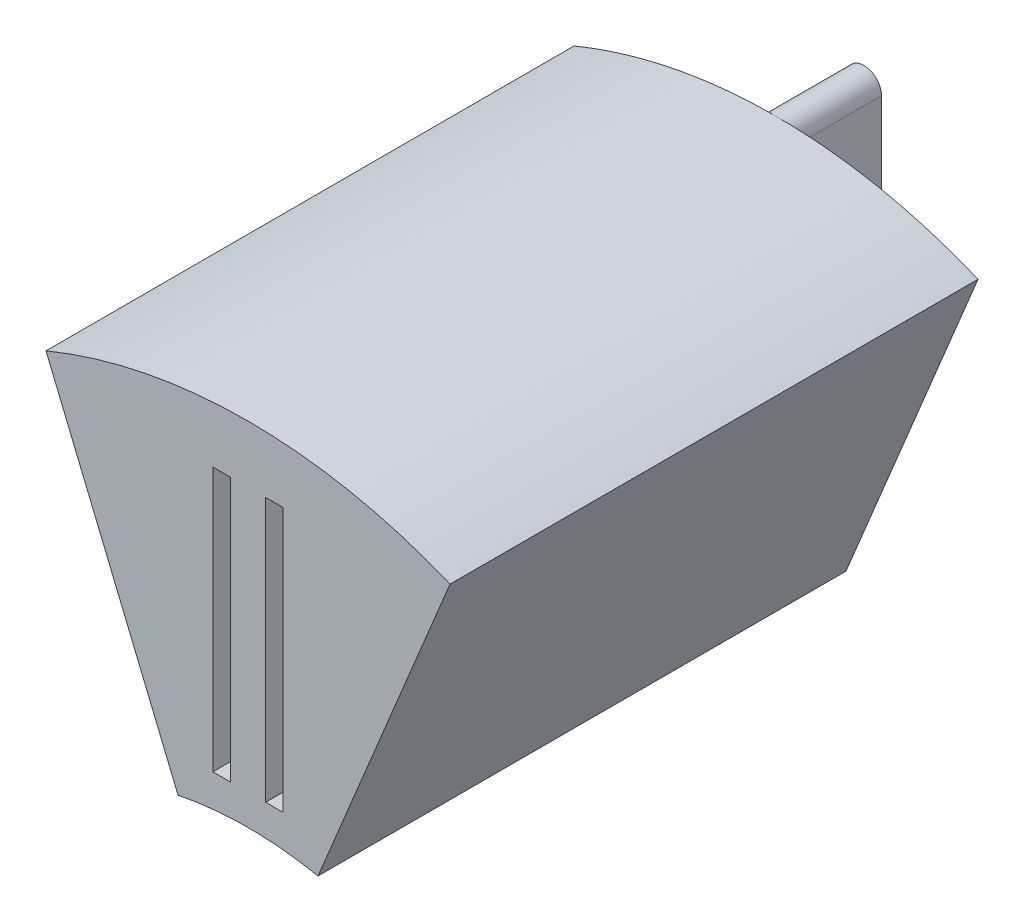
ISO-10303-21;
HEADER;
FILE_DESCRIPTION(('STEP AP214'),'2;1');
FILE_NAME('part.step','',(''),(''),'','','');
FILE_SCHEMA(('AUTOMOTIVE_DESIGN { 1 0 10303 214 1 1 1 1 }'));
ENDSEC;
DATA;
#1=APPLICATION_CONTEXT('core data for automotive mechanical design processes');
#2=APPLICATION_PROTOCOL_DEFINITION('international standard','automotive_design',2000,#1);
#3=PRODUCT_CONTEXT('',#1,'mechanical');
#4=PRODUCT('Part','Part','',(#3));
#5=PRODUCT_RELATED_PRODUCT_CATEGORY('part','',(#4));
#6=PRODUCT_DEFINITION_FORMATION('','',#4);
#7=PRODUCT_DEFINITION_CONTEXT('part definition',#1,'design');
#8=PRODUCT_DEFINITION('design','',#6,#7);
#9=PRODUCT_DEFINITION_SHAPE('','',#8);
#10=(LENGTH_UNIT() NAMED_UNIT(*) SI_UNIT(.MILLI.,.METRE.));
#11=(NAMED_UNIT(*) PLANE_ANGLE_UNIT() SI_UNIT($,.RADIAN.));
#12=(NAMED_UNIT(*) SI_UNIT($,.STERADIAN.) SOLID_ANGLE_UNIT());
#13=UNCERTAINTY_MEASURE_WITH_UNIT(LENGTH_MEASURE(1.E-05),#10,'distance_accuracy_value','');
#14=(GEOMETRIC_REPRESENTATION_CONTEXT(3) GLOBAL_UNCERTAINTY_ASSIGNED_CONTEXT((#13)) GLOBAL_UNIT_ASSIGNED_CONTEXT((#10,
#11,#12)) REPRESENTATION_CONTEXT('',''));
#15=CARTESIAN_POINT('',(0.,0.,0.));
#16=DIRECTION('',(0.,0.,1.));
#17=DIRECTION('',(1.,0.,0.));
#18=AXIS2_PLACEMENT_3D('',#15,#16,#17);
#19=CARTESIAN_POINT('',(0.,0.,0.));
#20=DIRECTION('',(0.,0.,1.));
#21=DIRECTION('',(1.,0.,0.));
#22=AXIS2_PLACEMENT_3D('',#19,#20,#21);
#23=PLANE('',#22);
#24=DIRECTION('',(0.,1.,0.));
#25=VECTOR('',#24,1.);
#26=CARTESIAN_POINT('',(-0.1,2.,0.));
#27=LINE('',#26,#25);
#28=CARTESIAN_POINT('',(-0.0999999999999996,2.,0.));
#29=VERTEX_POINT('',#28);
#30=CARTESIAN_POINT('',(-0.1,2.9,0.));
#31=VERTEX_POINT('',#30);
#32=EDGE_CURVE('E229',#29,#31,#27,.T.);
#33=ORIENTED_EDGE('',*,*,#32,.F.);
#34=DIRECTION('',(1.,0.,0.));
#35=VECTOR('',#34,1.);
#36=CARTESIAN_POINT('',(1.54782838582053,2.,0.));
#37=LINE('',#36,#35);
#38=CARTESIAN_POINT('',(0.1,2.,0.));
#39=VERTEX_POINT('',#38);
#40=EDGE_CURVE('E257',#29,#39,#37,.T.);
#41=ORIENTED_EDGE('',*,*,#40,.T.);
#42=DIRECTION('',(0.,-1.,0.));
#43=VECTOR('',#42,1.);
#44=CARTESIAN_POINT('',(0.1,2.,0.));
#45=LINE('',#44,#43);
#46=CARTESIAN_POINT('',(0.1,2.9,0.));
#47=VERTEX_POINT('',#46);
#48=EDGE_CURVE('E62',#47,#39,#45,.T.);
#49=ORIENTED_EDGE('',*,*,#48,.F.);
#50=CARTESIAN_POINT('',(0.,2.9,0.));
#51=DIRECTION('',(0.,0.,-1.));
#52=DIRECTION('',(-1.,0.,0.));
#53=AXIS2_PLACEMENT_3D('',#50,#51,#52);
#54=CIRCLE('',#53,0.1);
#55=CARTESIAN_POINT('',(0.,3.,0.));
#56=VERTEX_POINT('',#55);
#57=EDGE_CURVE('E214',#56,#47,#54,.T.);
#58=ORIENTED_EDGE('',*,*,#57,.F.);
#59=CARTESIAN_POINT('',(0.,0.,0.));
#60=DIRECTION('',(0.,0.,1.));
#61=DIRECTION('',(1.,0.,0.));
#62=AXIS2_PLACEMENT_3D('',#59,#60,#61);
#63=CIRCLE('',#62,3.);
#64=CARTESIAN_POINT('',(1.14805029709527,2.77163859753386,0.));
#65=VERTEX_POINT('',#64);
#66=EDGE_CURVE('E178',#65,#56,#63,.T.);
#67=ORIENTED_EDGE('',*,*,#66,.F.);
#68=DIRECTION('',(0.38268343236509,0.923879532511287,0.));
#69=VECTOR('',#68,1.);
#70=CARTESIAN_POINT('',(1.14805029709527,2.77163859753386,0.));
#71=LINE('',#70,#69);
#72=CARTESIAN_POINT('',(0.397672160236953,0.960065522622261,0.));
#73=VERTEX_POINT('',#72);
#74=EDGE_CURVE('E187',#73,#65,#71,.T.);
#75=ORIENTED_EDGE('',*,*,#74,.F.);
#76=CARTESIAN_POINT('',(0.,-1.,0.));
#77=DIRECTION('',(0.,0.,1.));
#78=DIRECTION('',(1.,0.,0.));
#79=AXIS2_PLACEMENT_3D('',#76,#77,#78);
#80=CIRCLE('',#79,2.);
#81=CARTESIAN_POINT('',(-0.397672160236953,0.960065522622261,0.));
#82=VERTEX_POINT('',#81);
#83=EDGE_CURVE('E54',#73,#82,#80,.T.);
#84=ORIENTED_EDGE('',*,*,#83,.T.);
#85=DIRECTION('',(0.38268343236509,-0.923879532511287,0.));
#86=VECTOR('',#85,1.);
#87=CARTESIAN_POINT('',(-1.14805029709527,2.77163859753386,0.));
#88=LINE('',#87,#86);
#89=CARTESIAN_POINT('',(-1.14805029709527,2.77163859753386,0.));
#90=VERTEX_POINT('',#89);
#91=EDGE_CURVE('E197',#90,#82,#88,.T.);
#92=ORIENTED_EDGE('',*,*,#91,.F.);
#93=EDGE_CURVE('E173',#56,#90,#63,.T.);
#94=ORIENTED_EDGE('',*,*,#93,.F.);
#95=EDGE_CURVE('E221',#31,#56,#54,.T.);
#96=ORIENTED_EDGE('',*,*,#95,.F.);
#97=EDGE_LOOP('',(#33,#41,#49,#58,#67,#75,#84,#92,#94,#96));
#98=FACE_BOUND('',#97,.T.);
#99=ADVANCED_FACE('F38',(#98),#23,.F.);
#100=CARTESIAN_POINT('',(0.2,1.17387953251129,1.));
#101=DIRECTION('',(0.,-0.8,0.6));
#102=DIRECTION('',(0.,-0.6,-0.8));
#103=AXIS2_PLACEMENT_3D('',#100,#101,#102);
#104=PLANE('',#103);
#105=DIRECTION('',(0.,-0.6,-0.8));
#106=VECTOR('',#105,1.);
#107=CARTESIAN_POINT('',(-0.1,1.17387953251129,1.));
#108=LINE('',#107,#106);
#109=CARTESIAN_POINT('',(-0.1,2.67387953251129,3.));
#110=VERTEX_POINT('',#109);
#111=CARTESIAN_POINT('',(-0.1,1.17387953251129,1.));
#112=VERTEX_POINT('',#111);
#113=EDGE_CURVE('E166',#110,#112,#108,.T.);
#114=ORIENTED_EDGE('',*,*,#113,.F.);
#115=DIRECTION('',(-1.,0.,0.));
#116=VECTOR('',#115,1.);
#117=CARTESIAN_POINT('',(0.2,2.67387953251129,3.));
#118=LINE('',#117,#116);
#119=CARTESIAN_POINT('',(-0.2,2.67387953251129,3.));
#120=VERTEX_POINT('',#119);
#121=EDGE_CURVE('E174',#110,#120,#118,.T.);
#122=ORIENTED_EDGE('',*,*,#121,.T.);
#123=DIRECTION('',(0.,0.6,0.8));
#124=VECTOR('',#123,1.);
#125=CARTESIAN_POINT('',(-0.2,1.17387953251129,1.));
#126=LINE('',#125,#124);
#127=CARTESIAN_POINT('',(-0.2,1.17387953251129,1.));
#128=VERTEX_POINT('',#127);
#129=EDGE_CURVE('E283',#128,#120,#126,.T.);
#130=ORIENTED_EDGE('',*,*,#129,.F.);
#131=DIRECTION('',(-1.,0.,0.));
#132=VECTOR('',#131,1.);
#133=CARTESIAN_POINT('',(0.2,1.17387953251129,1.));
#134=LINE('',#133,#132);
#135=EDGE_CURVE('E301',#112,#128,#134,.T.);
#136=ORIENTED_EDGE('',*,*,#135,.F.);
#137=EDGE_LOOP('',(#114,#122,#130,#136));
#138=FACE_BOUND('',#137,.T.);
#139=ADVANCED_FACE('F318',(#138),#104,.T.);
#140=CARTESIAN_POINT('',(0.2,1.17387953251129,3.));
#141=DIRECTION('',(0.,1.,0.));
#142=DIRECTION('',(0.,0.,1.));
#143=AXIS2_PLACEMENT_3D('',#140,#141,#142);
#144=PLANE('',#143);
#145=DIRECTION('',(0.,0.,1.));
#146=VECTOR('',#145,1.);
#147=CARTESIAN_POINT('',(-0.1,1.17387953251129,3.));
#148=LINE('',#147,#146);
#149=CARTESIAN_POINT('',(-0.1,1.17387953251129,3.));
#150=VERTEX_POINT('',#149);
#151=EDGE_CURVE('E211',#112,#150,#148,.T.);
#152=ORIENTED_EDGE('',*,*,#151,.F.);
#153=ORIENTED_EDGE('',*,*,#135,.T.);
#154=DIRECTION('',(0.,0.,-1.));
#155=VECTOR('',#154,1.);
#156=CARTESIAN_POINT('',(-0.2,1.17387953251129,3.));
#157=LINE('',#156,#155);
#158=CARTESIAN_POINT('',(-0.2,1.17387953251129,3.));
#159=VERTEX_POINT('',#158);
#160=EDGE_CURVE('E290',#159,#128,#157,.T.);
#161=ORIENTED_EDGE('',*,*,#160,.F.);
#162=DIRECTION('',(-1.,0.,0.));
#163=VECTOR('',#162,1.);
#164=CARTESIAN_POINT('',(0.2,1.17387953251129,3.));
#165=LINE('',#164,#163);
#166=EDGE_CURVE('E304',#150,#159,#165,.T.);
#167=ORIENTED_EDGE('',*,*,#166,.F.);
#168=EDGE_LOOP('',(#152,#153,#161,#167));
#169=FACE_BOUND('',#168,.T.);
#170=ADVANCED_FACE('F314',(#169),#144,.T.);
#171=CARTESIAN_POINT('',(0.,0.,3.));
#172=DIRECTION('',(0.,0.,1.));
#173=DIRECTION('',(1.,0.,0.));
#174=AXIS2_PLACEMENT_3D('',#171,#172,#173);
#175=PLANE('',#174);
#176=CARTESIAN_POINT('',(0.2,1.17387953251129,3.));
#177=VERTEX_POINT('',#176);
#178=CARTESIAN_POINT('',(0.1,1.17387953251129,3.));
#179=VERTEX_POINT('',#178);
#180=EDGE_CURVE('E152',#177,#179,#165,.T.);
#181=ORIENTED_EDGE('',*,*,#180,.T.);
#182=DIRECTION('',(0.,1.,0.));
#183=VECTOR('',#182,1.);
#184=CARTESIAN_POINT('',(0.1,2.67387953251129,3.));
#185=LINE('',#184,#183);
#186=CARTESIAN_POINT('',(0.1,2.67387953251129,3.));
#187=VERTEX_POINT('',#186);
#188=EDGE_CURVE('E145',#179,#187,#185,.T.);
#189=ORIENTED_EDGE('',*,*,#188,.T.);
#190=CARTESIAN_POINT('',(0.2,2.67387953251129,3.));
#191=VERTEX_POINT('',#190);
#192=EDGE_CURVE('E150',#191,#187,#118,.T.);
#193=ORIENTED_EDGE('',*,*,#192,.F.);
#194=DIRECTION('',(0.,-1.,0.));
#195=VECTOR('',#194,1.);
#196=CARTESIAN_POINT('',(0.2,2.67387953251129,3.));
#197=LINE('',#196,#195);
#198=EDGE_CURVE('E296',#191,#177,#197,.T.);
#199=ORIENTED_EDGE('',*,*,#198,.T.);
#200=EDGE_LOOP('',(#181,#189,#193,#199));
#201=FACE_BOUND('',#200,.T.);
#202=CARTESIAN_POINT('',(0.,0.,3.));
#203=DIRECTION('',(0.,0.,1.));
#204=DIRECTION('',(1.,0.,0.));
#205=AXIS2_PLACEMENT_3D('',#202,#203,#204);
#206=CIRCLE('',#205,3.);
#207=CARTESIAN_POINT('',(1.14805029709527,2.77163859753386,3.));
#208=VERTEX_POINT('',#207);
#209=CARTESIAN_POINT('',(-1.14805029709527,2.77163859753386,3.));
#210=VERTEX_POINT('',#209);
#211=EDGE_CURVE('E183',#208,#210,#206,.T.);
#212=ORIENTED_EDGE('',*,*,#211,.T.);
#213=DIRECTION('',(0.38268343236509,-0.923879532511287,0.));
#214=VECTOR('',#213,1.);
#215=CARTESIAN_POINT('',(-1.14805029709527,2.77163859753386,3.));
#216=LINE('',#215,#214);
#217=CARTESIAN_POINT('',(-0.397672160236953,0.960065522622261,3.));
#218=VERTEX_POINT('',#217);
#219=EDGE_CURVE('E186',#210,#218,#216,.T.);
#220=ORIENTED_EDGE('',*,*,#219,.T.);
#221=CARTESIAN_POINT('',(0.,-1.,3.));
#222=DIRECTION('',(0.,0.,1.));
#223=DIRECTION('',(1.,0.,0.));
#224=AXIS2_PLACEMENT_3D('',#221,#222,#223);
#225=CIRCLE('',#224,2.);
#226=CARTESIAN_POINT('',(0.397672160236953,0.960065522622261,3.));
#227=VERTEX_POINT('',#226);
#228=EDGE_CURVE('E254',#227,#218,#225,.T.);
#229=ORIENTED_EDGE('',*,*,#228,.F.);
#230=DIRECTION('',(0.38268343236509,0.923879532511287,0.));
#231=VECTOR('',#230,1.);
#232=CARTESIAN_POINT('',(1.14805029709527,2.77163859753386,3.));
#233=LINE('',#232,#231);
#234=EDGE_CURVE('E191',#227,#208,#233,.T.);
#235=ORIENTED_EDGE('',*,*,#234,.T.);
#236=EDGE_LOOP('',(#212,#220,#229,#235));
#237=FACE_BOUND('',#236,.T.);
#238=ORIENTED_EDGE('',*,*,#121,.F.);
#239=DIRECTION('',(0.,-1.,0.));
#240=VECTOR('',#239,1.);
#241=CARTESIAN_POINT('',(-0.1,2.67387953251129,3.));
#242=LINE('',#241,#240);
#243=EDGE_CURVE('E157',#110,#150,#242,.T.);
#244=ORIENTED_EDGE('',*,*,#243,.T.);
#245=ORIENTED_EDGE('',*,*,#166,.T.);
#246=DIRECTION('',(0.,-1.,0.));
#247=VECTOR('',#246,1.);
#248=CARTESIAN_POINT('',(-0.2,2.67387953251129,3.));
#249=LINE('',#248,#247);
#250=EDGE_CURVE('E287',#120,#159,#249,.T.);
#251=ORIENTED_EDGE('',*,*,#250,.F.);
#252=EDGE_LOOP('',(#238,#244,#245,#251));
#253=FACE_BOUND('',#252,.T.);
#254=ADVANCED_FACE('F147',(#201,#237,#253),#175,.T.);
#255=CARTESIAN_POINT('',(0.,0.,3.));
#256=DIRECTION('',(0.,0.,-1.));
#257=DIRECTION('',(-1.,0.,0.));
#258=AXIS2_PLACEMENT_3D('',#255,#256,#257);
#259=CYLINDRICAL_SURFACE('',#258,3.);
#260=ORIENTED_EDGE('',*,*,#66,.T.);
#261=ORIENTED_EDGE('',*,*,#93,.T.);
#262=DIRECTION('',(0.,0.,-1.));
#263=VECTOR('',#262,1.);
#264=CARTESIAN_POINT('',(-1.14805029709527,2.77163859753386,3.));
#265=LINE('',#264,#263);
#266=EDGE_CURVE('E205',#210,#90,#265,.T.);
#267=ORIENTED_EDGE('',*,*,#266,.F.);
#268=ORIENTED_EDGE('',*,*,#211,.F.);
#269=DIRECTION('',(0.,0.,-1.));
#270=VECTOR('',#269,1.);
#271=CARTESIAN_POINT('',(1.14805029709527,2.77163859753386,3.));
#272=LINE('',#271,#270);
#273=EDGE_CURVE('E193',#208,#65,#272,.T.);
#274=ORIENTED_EDGE('',*,*,#273,.T.);
#275=EDGE_LOOP('',(#260,#261,#267,#268,#274));
#276=FACE_BOUND('',#275,.T.);
#277=ADVANCED_FACE('F40',(#276),#259,.T.);
#278=CARTESIAN_POINT('',(-1.14805029709527,2.77163859753386,3.));
#279=DIRECTION('',(0.923879532511287,0.38268343236509,0.));
#280=DIRECTION('',(-0.38268343236509,0.923879532511287,0.));
#281=AXIS2_PLACEMENT_3D('',#278,#279,#280);
#282=PLANE('',#281);
#283=ORIENTED_EDGE('',*,*,#91,.T.);
#284=DIRECTION('',(0.,0.,1.));
#285=VECTOR('',#284,1.);
#286=CARTESIAN_POINT('',(-0.397672160236953,0.96006552262226,0.));
#287=LINE('',#286,#285);
#288=EDGE_CURVE('E235',#82,#218,#287,.T.);
#289=ORIENTED_EDGE('',*,*,#288,.T.);
#290=ORIENTED_EDGE('',*,*,#219,.F.);
#291=ORIENTED_EDGE('',*,*,#266,.T.);
#292=EDGE_LOOP('',(#283,#289,#290,#291));
#293=FACE_BOUND('',#292,.T.);
#294=ADVANCED_FACE('F345',(#293),#282,.F.);
#295=CARTESIAN_POINT('',(1.14805029709527,2.77163859753386,3.));
#296=DIRECTION('',(-0.923879532511287,0.38268343236509,0.));
#297=DIRECTION('',(-0.38268343236509,-0.923879532511287,0.));
#298=AXIS2_PLACEMENT_3D('',#295,#296,#297);
#299=PLANE('',#298);
#300=ORIENTED_EDGE('',*,*,#234,.F.);
#301=DIRECTION('',(0.,0.,1.));
#302=VECTOR('',#301,1.);
#303=CARTESIAN_POINT('',(0.397672160236953,0.96006552262226,0.));
#304=LINE('',#303,#302);
#305=EDGE_CURVE('E47',#227,#73,#304,.F.);
#306=ORIENTED_EDGE('',*,*,#305,.T.);
#307=ORIENTED_EDGE('',*,*,#74,.T.);
#308=ORIENTED_EDGE('',*,*,#273,.F.);
#309=EDGE_LOOP('',(#300,#306,#307,#308));
#310=FACE_BOUND('',#309,.T.);
#311=ADVANCED_FACE('F334',(#310),#299,.F.);
#312=CARTESIAN_POINT('',(0.1,2.,3.5));
#313=DIRECTION('',(-1.,0.,0.));
#314=DIRECTION('',(0.,0.,1.));
#315=AXIS2_PLACEMENT_3D('',#312,#313,#314);
#316=PLANE('',#315);
#317=DIRECTION('',(0.,0.6,0.8));
#318=VECTOR('',#317,1.);
#319=CARTESIAN_POINT('',(0.1,1.17387953251129,1.));
#320=LINE('',#319,#318);
#321=CARTESIAN_POINT('',(0.1,1.17387953251129,1.));
#322=VERTEX_POINT('',#321);
#323=EDGE_CURVE('E156',#322,#187,#320,.T.);
#324=ORIENTED_EDGE('',*,*,#323,.T.);
#325=ORIENTED_EDGE('',*,*,#188,.F.);
#326=DIRECTION('',(0.,0.,-1.));
#327=VECTOR('',#326,1.);
#328=CARTESIAN_POINT('',(0.1,1.17387953251129,3.));
#329=LINE('',#328,#327);
#330=EDGE_CURVE('E161',#179,#322,#329,.T.);
#331=ORIENTED_EDGE('',*,*,#330,.T.);
#332=EDGE_LOOP('',(#324,#325,#331));
#333=FACE_BOUND('',#332,.T.);
#334=ADVANCED_FACE('F160',(#333),#316,.F.);
#335=CARTESIAN_POINT('',(-0.1,2.,3.5));
#336=DIRECTION('',(1.,0.,0.));
#337=DIRECTION('',(0.,0.,-1.));
#338=AXIS2_PLACEMENT_3D('',#335,#336,#337);
#339=PLANE('',#338);
#340=ORIENTED_EDGE('',*,*,#243,.F.);
#341=ORIENTED_EDGE('',*,*,#113,.T.);
#342=ORIENTED_EDGE('',*,*,#151,.T.);
#343=EDGE_LOOP('',(#340,#341,#342));
#344=FACE_BOUND('',#343,.T.);
#345=ADVANCED_FACE('F325',(#344),#339,.F.);
#346=ORIENTED_EDGE('',*,*,#323,.F.);
#347=CARTESIAN_POINT('',(0.2,1.17387953251129,1.));
#348=VERTEX_POINT('',#347);
#349=EDGE_CURVE('E302',#348,#322,#134,.T.);
#350=ORIENTED_EDGE('',*,*,#349,.F.);
#351=DIRECTION('',(0.,0.6,0.8));
#352=VECTOR('',#351,1.);
#353=CARTESIAN_POINT('',(0.2,1.17387953251129,1.));
#354=LINE('',#353,#352);
#355=EDGE_CURVE('E171',#348,#191,#354,.T.);
#356=ORIENTED_EDGE('',*,*,#355,.T.);
#357=ORIENTED_EDGE('',*,*,#192,.T.);
#358=EDGE_LOOP('',(#346,#350,#356,#357));
#359=FACE_BOUND('',#358,.T.);
#360=ADVANCED_FACE('F169',(#359),#104,.T.);
#361=ORIENTED_EDGE('',*,*,#330,.F.);
#362=ORIENTED_EDGE('',*,*,#180,.F.);
#363=DIRECTION('',(0.,0.,-1.));
#364=VECTOR('',#363,1.);
#365=CARTESIAN_POINT('',(0.2,1.17387953251129,3.));
#366=LINE('',#365,#364);
#367=EDGE_CURVE('E299',#177,#348,#366,.T.);
#368=ORIENTED_EDGE('',*,*,#367,.T.);
#369=ORIENTED_EDGE('',*,*,#349,.T.);
#370=EDGE_LOOP('',(#361,#362,#368,#369));
#371=FACE_BOUND('',#370,.T.);
#372=ADVANCED_FACE('F332',(#371),#144,.T.);
#373=CARTESIAN_POINT('',(0.2,0.,0.));
#374=DIRECTION('',(1.,0.,0.));
#375=DIRECTION('',(0.,0.,-1.));
#376=AXIS2_PLACEMENT_3D('',#373,#374,#375);
#377=PLANE('',#376);
#378=ORIENTED_EDGE('',*,*,#355,.F.);
#379=ORIENTED_EDGE('',*,*,#367,.F.);
#380=ORIENTED_EDGE('',*,*,#198,.F.);
#381=EDGE_LOOP('',(#378,#379,#380));
#382=FACE_BOUND('',#381,.T.);
#383=ADVANCED_FACE('F371',(#382),#377,.F.);
#384=CARTESIAN_POINT('',(-0.2,0.,0.));
#385=DIRECTION('',(1.,0.,0.));
#386=DIRECTION('',(0.,0.,-1.));
#387=AXIS2_PLACEMENT_3D('',#384,#385,#386);
#388=PLANE('',#387);
#389=ORIENTED_EDGE('',*,*,#129,.T.);
#390=ORIENTED_EDGE('',*,*,#250,.T.);
#391=ORIENTED_EDGE('',*,*,#160,.T.);
#392=EDGE_LOOP('',(#389,#390,#391));
#393=FACE_BOUND('',#392,.T.);
#394=ADVANCED_FACE('F322',(#393),#388,.T.);
#395=CARTESIAN_POINT('',(-0.1,2.,-0.5));
#396=DIRECTION('',(1.,0.,0.));
#397=DIRECTION('',(0.,0.,-1.));
#398=AXIS2_PLACEMENT_3D('',#395,#396,#397);
#399=PLANE('',#398);
#400=ORIENTED_EDGE('',*,*,#32,.T.);
#401=DIRECTION('',(0.,0.,1.));
#402=VECTOR('',#401,1.);
#403=CARTESIAN_POINT('',(-0.1,2.9,-0.5));
#404=LINE('',#403,#402);
#405=CARTESIAN_POINT('',(-0.1,2.9,-0.5));
#406=VERTEX_POINT('',#405);
#407=EDGE_CURVE('E269',#406,#31,#404,.T.);
#408=ORIENTED_EDGE('',*,*,#407,.F.);
#409=DIRECTION('',(0.,1.,0.));
#410=VECTOR('',#409,1.);
#411=CARTESIAN_POINT('',(-0.1,2.,-0.5));
#412=LINE('',#411,#410);
#413=CARTESIAN_POINT('',(-0.1,2.,-0.5));
#414=VERTEX_POINT('',#413);
#415=EDGE_CURVE('E233',#414,#406,#412,.T.);
#416=ORIENTED_EDGE('',*,*,#415,.F.);
#417=DIRECTION('',(0.,0.,1.));
#418=VECTOR('',#417,1.);
#419=CARTESIAN_POINT('',(-0.1,2.,-0.5));
#420=LINE('',#419,#418);
#421=EDGE_CURVE('E273',#414,#29,#420,.T.);
#422=ORIENTED_EDGE('',*,*,#421,.T.);
#423=EDGE_LOOP('',(#400,#408,#416,#422));
#424=FACE_BOUND('',#423,.T.);
#425=ADVANCED_FACE('F382',(#424),#399,.F.);
#426=CARTESIAN_POINT('',(0.,2.9,-0.5));
#427=DIRECTION('',(0.,0.,1.));
#428=DIRECTION('',(1.,0.,0.));
#429=AXIS2_PLACEMENT_3D('',#426,#427,#428);
#430=CYLINDRICAL_SURFACE('',#429,0.1);
#431=ORIENTED_EDGE('',*,*,#95,.T.);
#432=ORIENTED_EDGE('',*,*,#57,.T.);
#433=DIRECTION('',(0.,0.,1.));
#434=VECTOR('',#433,1.);
#435=CARTESIAN_POINT('',(0.1,2.9,-0.5));
#436=LINE('',#435,#434);
#437=CARTESIAN_POINT('',(0.1,2.9,-0.5));
#438=VERTEX_POINT('',#437);
#439=EDGE_CURVE('E266',#438,#47,#436,.T.);
#440=ORIENTED_EDGE('',*,*,#439,.F.);
#441=CARTESIAN_POINT('',(0.,2.9,-0.5));
#442=DIRECTION('',(0.,0.,-1.));
#443=DIRECTION('',(-1.,0.,0.));
#444=AXIS2_PLACEMENT_3D('',#441,#442,#443);
#445=CIRCLE('',#444,0.1);
#446=EDGE_CURVE('E249',#406,#438,#445,.T.);
#447=ORIENTED_EDGE('',*,*,#446,.F.);
#448=ORIENTED_EDGE('',*,*,#407,.T.);
#449=EDGE_LOOP('',(#431,#432,#440,#447,#448));
#450=FACE_BOUND('',#449,.T.);
#451=ADVANCED_FACE('F387',(#450),#430,.T.);
#452=CARTESIAN_POINT('',(0.1,2.,-0.5));
#453=DIRECTION('',(-1.,0.,0.));
#454=DIRECTION('',(0.,0.,1.));
#455=AXIS2_PLACEMENT_3D('',#452,#453,#454);
#456=PLANE('',#455);
#457=ORIENTED_EDGE('',*,*,#48,.T.);
#458=DIRECTION('',(0.,0.,1.));
#459=VECTOR('',#458,1.);
#460=CARTESIAN_POINT('',(0.1,2.,-0.5));
#461=LINE('',#460,#459);
#462=CARTESIAN_POINT('',(0.1,2.,-0.5));
#463=VERTEX_POINT('',#462);
#464=EDGE_CURVE('E248',#463,#39,#461,.T.);
#465=ORIENTED_EDGE('',*,*,#464,.F.);
#466=DIRECTION('',(0.,-1.,0.));
#467=VECTOR('',#466,1.);
#468=CARTESIAN_POINT('',(0.1,2.,-0.5));
#469=LINE('',#468,#467);
#470=EDGE_CURVE('E244',#438,#463,#469,.T.);
#471=ORIENTED_EDGE('',*,*,#470,.F.);
#472=ORIENTED_EDGE('',*,*,#439,.T.);
#473=EDGE_LOOP('',(#457,#465,#471,#472));
#474=FACE_BOUND('',#473,.T.);
#475=ADVANCED_FACE('F264',(#474),#456,.F.);
#476=CARTESIAN_POINT('',(0.,2.,-0.5));
#477=DIRECTION('',(0.,0.,-1.));
#478=DIRECTION('',(-1.,0.,0.));
#479=AXIS2_PLACEMENT_3D('',#476,#477,#478);
#480=PLANE('',#479);
#481=DIRECTION('',(1.,0.,0.));
#482=VECTOR('',#481,1.);
#483=CARTESIAN_POINT('',(0.,2.,-0.5));
#484=LINE('',#483,#482);
#485=EDGE_CURVE('E11',#414,#463,#484,.T.);
#486=ORIENTED_EDGE('',*,*,#485,.F.);
#487=ORIENTED_EDGE('',*,*,#415,.T.);
#488=ORIENTED_EDGE('',*,*,#446,.T.);
#489=ORIENTED_EDGE('',*,*,#470,.T.);
#490=EDGE_LOOP('',(#486,#487,#488,#489));
#491=FACE_BOUND('',#490,.T.);
#492=ADVANCED_FACE('F392',(#491),#480,.T.);
#493=CARTESIAN_POINT('',(0.,-1.,0.));
#494=DIRECTION('',(0.,0.,1.));
#495=DIRECTION('',(1.,0.,0.));
#496=AXIS2_PLACEMENT_3D('',#493,#494,#495);
#497=CYLINDRICAL_SURFACE('',#496,2.);
#498=ORIENTED_EDGE('',*,*,#83,.F.);
#499=ORIENTED_EDGE('',*,*,#305,.F.);
#500=ORIENTED_EDGE('',*,*,#228,.T.);
#501=ORIENTED_EDGE('',*,*,#288,.F.);
#502=EDGE_LOOP('',(#498,#499,#500,#501));
#503=FACE_BOUND('',#502,.T.);
#504=ADVANCED_FACE('F357',(#503),#497,.F.);
#505=CARTESIAN_POINT('',(1.54782838582053,2.,0.));
#506=DIRECTION('',(0.,1.,0.));
#507=DIRECTION('',(0.,0.,1.));
#508=AXIS2_PLACEMENT_3D('',#505,#506,#507);
#509=PLANE('',#508);
#510=ORIENTED_EDGE('',*,*,#485,.T.);
#511=ORIENTED_EDGE('',*,*,#464,.T.);
#512=ORIENTED_EDGE('',*,*,#40,.F.);
#513=ORIENTED_EDGE('',*,*,#421,.F.);
#514=EDGE_LOOP('',(#510,#511,#512,#513));
#515=FACE_BOUND('',#514,.T.);
#516=ADVANCED_FACE('F398',(#515),#509,.F.);
#517=CLOSED_SHELL('',(#99,#139,#170,#254,#277,#294,#311,#334,#345,#360,#372,#383,#394,#425,#451,
#475,#492,#504,#516));
#518=MANIFOLD_SOLID_BREP('B2',#517);
#519=ADVANCED_BREP_SHAPE_REPRESENTATION('',(#18,#518),#14);
#520=SHAPE_DEFINITION_REPRESENTATION(#9,#519);
ENDSEC;
END-ISO-10303-21;
